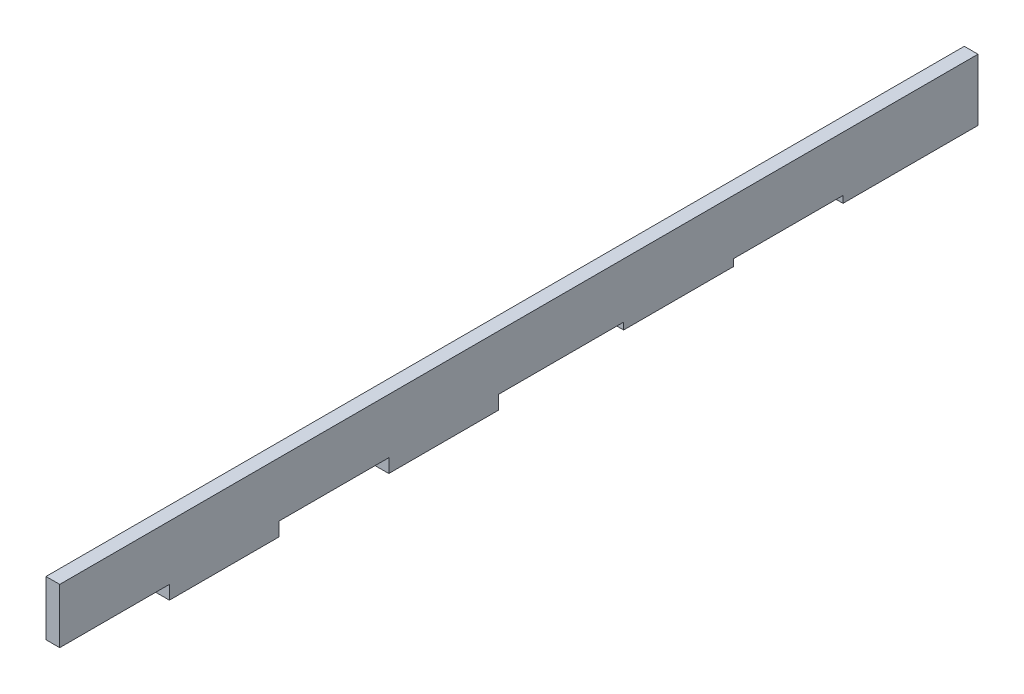
ISO-10303-21;
HEADER;
FILE_DESCRIPTION(('STEP AP214'),'2;1');
FILE_NAME('part.step','',(''),(''),'','','');
FILE_SCHEMA(('AUTOMOTIVE_DESIGN { 1 0 10303 214 1 1 1 1 }'));
ENDSEC;
DATA;
#1=APPLICATION_CONTEXT('core data for automotive mechanical design processes');
#2=APPLICATION_PROTOCOL_DEFINITION('international standard','automotive_design',2000,#1);
#3=PRODUCT_CONTEXT('',#1,'mechanical');
#4=PRODUCT('Part','Part','',(#3));
#5=PRODUCT_RELATED_PRODUCT_CATEGORY('part','',(#4));
#6=PRODUCT_DEFINITION_FORMATION('','',#4);
#7=PRODUCT_DEFINITION_CONTEXT('part definition',#1,'design');
#8=PRODUCT_DEFINITION('design','',#6,#7);
#9=PRODUCT_DEFINITION_SHAPE('','',#8);
#10=(LENGTH_UNIT() NAMED_UNIT(*) SI_UNIT(.MILLI.,.METRE.));
#11=(NAMED_UNIT(*) PLANE_ANGLE_UNIT() SI_UNIT($,.RADIAN.));
#12=(NAMED_UNIT(*) SI_UNIT($,.STERADIAN.) SOLID_ANGLE_UNIT());
#13=UNCERTAINTY_MEASURE_WITH_UNIT(LENGTH_MEASURE(1.E-05),#10,'distance_accuracy_value','');
#14=(GEOMETRIC_REPRESENTATION_CONTEXT(3) GLOBAL_UNCERTAINTY_ASSIGNED_CONTEXT((#13)) GLOBAL_UNIT_ASSIGNED_CONTEXT((#10,
#11,#12)) REPRESENTATION_CONTEXT('',''));
#15=CARTESIAN_POINT('',(0.,0.,0.));
#16=DIRECTION('',(0.,0.,1.));
#17=DIRECTION('',(1.,0.,0.));
#18=AXIS2_PLACEMENT_3D('',#15,#16,#17);
#19=CARTESIAN_POINT('',(6.35,6.34999999999997,-309.479378365372));
#20=DIRECTION('',(0.,1.,0.));
#21=DIRECTION('',(0.,0.,1.));
#22=AXIS2_PLACEMENT_3D('',#19,#20,#21);
#23=PLANE('',#22);
#24=DIRECTION('',(0.,0.,-1.));
#25=VECTOR('',#24,1.);
#26=CARTESIAN_POINT('',(0.,6.34999999999997,-309.479378365372));
#27=LINE('',#26,#25);
#28=CARTESIAN_POINT('',(0.,6.34999999999997,-309.479378365372));
#29=VERTEX_POINT('',#28);
#30=CARTESIAN_POINT('',(0.,6.34999999999997,-360.279378365372));
#31=VERTEX_POINT('',#30);
#32=EDGE_CURVE('E191',#29,#31,#27,.T.);
#33=ORIENTED_EDGE('',*,*,#32,.T.);
#34=DIRECTION('',(-1.,0.,0.));
#35=VECTOR('',#34,1.);
#36=CARTESIAN_POINT('',(6.35,6.34999999999997,-360.279378365372));
#37=LINE('',#36,#35);
#38=CARTESIAN_POINT('',(6.35,6.34999999999997,-360.279378365372));
#39=VERTEX_POINT('',#38);
#40=EDGE_CURVE('E11',#39,#31,#37,.T.);
#41=ORIENTED_EDGE('',*,*,#40,.F.);
#42=DIRECTION('',(0.,0.,-1.));
#43=VECTOR('',#42,1.);
#44=CARTESIAN_POINT('',(6.35,6.34999999999997,-309.479378365372));
#45=LINE('',#44,#43);
#46=CARTESIAN_POINT('',(6.35,6.34999999999997,-309.479378365372));
#47=VERTEX_POINT('',#46);
#48=EDGE_CURVE('E226',#47,#39,#45,.T.);
#49=ORIENTED_EDGE('',*,*,#48,.F.);
#50=DIRECTION('',(-1.,0.,0.));
#51=VECTOR('',#50,1.);
#52=CARTESIAN_POINT('',(6.35,6.34999999999997,-309.479378365372));
#53=LINE('',#52,#51);
#54=EDGE_CURVE('E187',#47,#29,#53,.T.);
#55=ORIENTED_EDGE('',*,*,#54,.T.);
#56=EDGE_LOOP('',(#33,#41,#49,#55));
#57=FACE_BOUND('',#56,.T.);
#58=ADVANCED_FACE('F35',(#57),#23,.F.);
#59=CARTESIAN_POINT('',(6.35,6.34999999999997,-360.279378365372));
#60=DIRECTION('',(0.,0.,-1.));
#61=DIRECTION('',(-1.,0.,0.));
#62=AXIS2_PLACEMENT_3D('',#59,#60,#61);
#63=PLANE('',#62);
#64=DIRECTION('',(0.,-1.,0.));
#65=VECTOR('',#64,1.);
#66=CARTESIAN_POINT('',(0.,6.34999999999997,-360.279378365372));
#67=LINE('',#66,#65);
#68=CARTESIAN_POINT('',(0.,3.17499999999997,-360.279378365372));
#69=VERTEX_POINT('',#68);
#70=EDGE_CURVE('E194',#31,#69,#67,.T.);
#71=ORIENTED_EDGE('',*,*,#70,.T.);
#72=DIRECTION('',(-1.,0.,0.));
#73=VECTOR('',#72,1.);
#74=CARTESIAN_POINT('',(6.35,3.17499999999997,-360.279378365372));
#75=LINE('',#74,#73);
#76=CARTESIAN_POINT('',(6.35,3.17499999999997,-360.279378365372));
#77=VERTEX_POINT('',#76);
#78=EDGE_CURVE('E43',#77,#69,#75,.T.);
#79=ORIENTED_EDGE('',*,*,#78,.F.);
#80=DIRECTION('',(0.,-1.,0.));
#81=VECTOR('',#80,1.);
#82=CARTESIAN_POINT('',(6.35,6.34999999999997,-360.279378365372));
#83=LINE('',#82,#81);
#84=EDGE_CURVE('E124',#39,#77,#83,.T.);
#85=ORIENTED_EDGE('',*,*,#84,.F.);
#86=ORIENTED_EDGE('',*,*,#40,.T.);
#87=EDGE_LOOP('',(#71,#79,#85,#86));
#88=FACE_BOUND('',#87,.T.);
#89=ADVANCED_FACE('F333',(#88),#63,.F.);
#90=CARTESIAN_POINT('',(6.35,3.17499999999997,-360.279378365372));
#91=DIRECTION('',(0.,1.,0.));
#92=DIRECTION('',(0.,0.,1.));
#93=AXIS2_PLACEMENT_3D('',#90,#91,#92);
#94=PLANE('',#93);
#95=DIRECTION('',(0.,0.,-1.));
#96=VECTOR('',#95,1.);
#97=CARTESIAN_POINT('',(0.,3.17499999999997,-360.279378365372));
#98=LINE('',#97,#96);
#99=CARTESIAN_POINT('',(0.,3.17499999999997,-422.789544579189));
#100=VERTEX_POINT('',#99);
#101=EDGE_CURVE('E196',#69,#100,#98,.T.);
#102=ORIENTED_EDGE('',*,*,#101,.T.);
#103=DIRECTION('',(-1.,0.,0.));
#104=VECTOR('',#103,1.);
#105=CARTESIAN_POINT('',(6.35,3.17499999999997,-422.789544579189));
#106=LINE('',#105,#104);
#107=CARTESIAN_POINT('',(6.35,3.17499999999997,-422.789544579189));
#108=VERTEX_POINT('',#107);
#109=EDGE_CURVE('E263',#108,#100,#106,.T.);
#110=ORIENTED_EDGE('',*,*,#109,.F.);
#111=DIRECTION('',(0.,0.,-1.));
#112=VECTOR('',#111,1.);
#113=CARTESIAN_POINT('',(6.35,3.17499999999997,-360.279378365372));
#114=LINE('',#113,#112);
#115=EDGE_CURVE('E271',#77,#108,#114,.T.);
#116=ORIENTED_EDGE('',*,*,#115,.F.);
#117=ORIENTED_EDGE('',*,*,#78,.T.);
#118=EDGE_LOOP('',(#102,#110,#116,#117));
#119=FACE_BOUND('',#118,.T.);
#120=ADVANCED_FACE('F269',(#119),#94,.F.);
#121=CARTESIAN_POINT('',(6.35,3.17499999999997,-422.789544579189));
#122=DIRECTION('',(0.,0.,1.));
#123=DIRECTION('',(1.,0.,0.));
#124=AXIS2_PLACEMENT_3D('',#121,#122,#123);
#125=PLANE('',#124);
#126=DIRECTION('',(0.,1.,0.));
#127=VECTOR('',#126,1.);
#128=CARTESIAN_POINT('',(0.,3.17499999999997,-422.789544579189));
#129=LINE('',#128,#127);
#130=CARTESIAN_POINT('',(0.,31.7499999999996,-422.789544579189));
#131=VERTEX_POINT('',#130);
#132=EDGE_CURVE('E198',#100,#131,#129,.T.);
#133=ORIENTED_EDGE('',*,*,#132,.T.);
#134=DIRECTION('',(-1.,0.,0.));
#135=VECTOR('',#134,1.);
#136=CARTESIAN_POINT('',(6.35,31.7499999999996,-422.789544579189));
#137=LINE('',#136,#135);
#138=CARTESIAN_POINT('',(6.35,31.7499999999996,-422.789544579189));
#139=VERTEX_POINT('',#138);
#140=EDGE_CURVE('E260',#139,#131,#137,.T.);
#141=ORIENTED_EDGE('',*,*,#140,.F.);
#142=DIRECTION('',(0.,1.,0.));
#143=VECTOR('',#142,1.);
#144=CARTESIAN_POINT('',(6.35,3.17499999999997,-422.789544579189));
#145=LINE('',#144,#143);
#146=EDGE_CURVE('E289',#108,#139,#145,.T.);
#147=ORIENTED_EDGE('',*,*,#146,.F.);
#148=ORIENTED_EDGE('',*,*,#109,.T.);
#149=EDGE_LOOP('',(#133,#141,#147,#148));
#150=FACE_BOUND('',#149,.T.);
#151=ADVANCED_FACE('F280',(#150),#125,.F.);
#152=CARTESIAN_POINT('',(6.35,31.7499999999996,2.48059425587843));
#153=DIRECTION('',(0.,-1.,0.));
#154=DIRECTION('',(0.,0.,-1.));
#155=AXIS2_PLACEMENT_3D('',#152,#153,#154);
#156=PLANE('',#155);
#157=DIRECTION('',(0.,0.,1.));
#158=VECTOR('',#157,1.);
#159=CARTESIAN_POINT('',(0.,31.7499999999996,2.48059425587843));
#160=LINE('',#159,#158);
#161=CARTESIAN_POINT('',(0.,31.7499999999996,2.48059425587843));
#162=VERTEX_POINT('',#161);
#163=EDGE_CURVE('E200',#131,#162,#160,.T.);
#164=ORIENTED_EDGE('',*,*,#163,.T.);
#165=DIRECTION('',(-1.,0.,0.));
#166=VECTOR('',#165,1.);
#167=CARTESIAN_POINT('',(6.35,31.7499999999996,2.48059425587843));
#168=LINE('',#167,#166);
#169=CARTESIAN_POINT('',(6.35,31.7499999999996,2.48059425587843));
#170=VERTEX_POINT('',#169);
#171=EDGE_CURVE('E257',#170,#162,#168,.T.);
#172=ORIENTED_EDGE('',*,*,#171,.F.);
#173=DIRECTION('',(0.,0.,1.));
#174=VECTOR('',#173,1.);
#175=CARTESIAN_POINT('',(6.35,31.7499999999996,2.48059425587843));
#176=LINE('',#175,#174);
#177=EDGE_CURVE('E286',#139,#170,#176,.T.);
#178=ORIENTED_EDGE('',*,*,#177,.F.);
#179=ORIENTED_EDGE('',*,*,#140,.T.);
#180=EDGE_LOOP('',(#164,#172,#178,#179));
#181=FACE_BOUND('',#180,.T.);
#182=ADVANCED_FACE('F284',(#181),#156,.F.);
#183=CARTESIAN_POINT('',(6.35,6.34999999999997,2.48059425587843));
#184=DIRECTION('',(0.,0.,-1.));
#185=DIRECTION('',(-1.,0.,0.));
#186=AXIS2_PLACEMENT_3D('',#183,#184,#185);
#187=PLANE('',#186);
#188=DIRECTION('',(0.,-1.,0.));
#189=VECTOR('',#188,1.);
#190=CARTESIAN_POINT('',(0.,6.34999999999997,2.48059425587843));
#191=LINE('',#190,#189);
#192=CARTESIAN_POINT('',(0.,6.34999999999997,2.48059425587843));
#193=VERTEX_POINT('',#192);
#194=EDGE_CURVE('E202',#162,#193,#191,.T.);
#195=ORIENTED_EDGE('',*,*,#194,.T.);
#196=DIRECTION('',(-1.,0.,0.));
#197=VECTOR('',#196,1.);
#198=CARTESIAN_POINT('',(6.35,6.34999999999997,2.48059425587843));
#199=LINE('',#198,#197);
#200=CARTESIAN_POINT('',(6.35,6.34999999999997,2.48059425587843));
#201=VERTEX_POINT('',#200);
#202=EDGE_CURVE('E254',#201,#193,#199,.T.);
#203=ORIENTED_EDGE('',*,*,#202,.F.);
#204=DIRECTION('',(0.,-1.,0.));
#205=VECTOR('',#204,1.);
#206=CARTESIAN_POINT('',(6.35,6.34999999999997,2.48059425587843));
#207=LINE('',#206,#205);
#208=EDGE_CURVE('E288',#170,#201,#207,.T.);
#209=ORIENTED_EDGE('',*,*,#208,.F.);
#210=ORIENTED_EDGE('',*,*,#171,.T.);
#211=EDGE_LOOP('',(#195,#203,#209,#210));
#212=FACE_BOUND('',#211,.T.);
#213=ADVANCED_FACE('F346',(#212),#187,.F.);
#214=CARTESIAN_POINT('',(6.35,6.34999999999997,2.48059425587843));
#215=DIRECTION('',(0.,1.,0.));
#216=DIRECTION('',(0.,0.,1.));
#217=AXIS2_PLACEMENT_3D('',#214,#215,#216);
#218=PLANE('',#217);
#219=DIRECTION('',(0.,0.,-1.));
#220=VECTOR('',#219,1.);
#221=CARTESIAN_POINT('',(0.,6.34999999999997,2.48059425587843));
#222=LINE('',#221,#220);
#223=CARTESIAN_POINT('',(0.,6.34999999999999,-48.3194057441216));
#224=VERTEX_POINT('',#223);
#225=EDGE_CURVE('E204',#193,#224,#222,.T.);
#226=ORIENTED_EDGE('',*,*,#225,.T.);
#227=DIRECTION('',(-1.,0.,0.));
#228=VECTOR('',#227,1.);
#229=CARTESIAN_POINT('',(6.35,6.34999999999999,-48.3194057441216));
#230=LINE('',#229,#228);
#231=CARTESIAN_POINT('',(6.35,6.34999999999999,-48.3194057441216));
#232=VERTEX_POINT('',#231);
#233=EDGE_CURVE('E251',#232,#224,#230,.T.);
#234=ORIENTED_EDGE('',*,*,#233,.F.);
#235=DIRECTION('',(0.,0.,-1.));
#236=VECTOR('',#235,1.);
#237=CARTESIAN_POINT('',(6.35,6.34999999999997,2.48059425587843));
#238=LINE('',#237,#236);
#239=EDGE_CURVE('E291',#201,#232,#238,.T.);
#240=ORIENTED_EDGE('',*,*,#239,.F.);
#241=ORIENTED_EDGE('',*,*,#202,.T.);
#242=EDGE_LOOP('',(#226,#234,#240,#241));
#243=FACE_BOUND('',#242,.T.);
#244=ADVANCED_FACE('F349',(#243),#218,.F.);
#245=CARTESIAN_POINT('',(6.35,6.34999999999999,-48.3194057441216));
#246=DIRECTION('',(0.,0.,-1.));
#247=DIRECTION('',(-1.,0.,0.));
#248=AXIS2_PLACEMENT_3D('',#245,#246,#247);
#249=PLANE('',#248);
#250=DIRECTION('',(0.,-1.,0.));
#251=VECTOR('',#250,1.);
#252=CARTESIAN_POINT('',(0.,6.34999999999999,-48.3194057441216));
#253=LINE('',#252,#251);
#254=CARTESIAN_POINT('',(0.,0.,-48.3194057441216));
#255=VERTEX_POINT('',#254);
#256=EDGE_CURVE('E206',#224,#255,#253,.T.);
#257=ORIENTED_EDGE('',*,*,#256,.T.);
#258=DIRECTION('',(-1.,0.,0.));
#259=VECTOR('',#258,1.);
#260=CARTESIAN_POINT('',(6.35,0.,-48.3194057441216));
#261=LINE('',#260,#259);
#262=CARTESIAN_POINT('',(6.35,0.,-48.3194057441216));
#263=VERTEX_POINT('',#262);
#264=EDGE_CURVE('E248',#263,#255,#261,.T.);
#265=ORIENTED_EDGE('',*,*,#264,.F.);
#266=DIRECTION('',(0.,-1.,0.));
#267=VECTOR('',#266,1.);
#268=CARTESIAN_POINT('',(6.35,6.34999999999999,-48.3194057441216));
#269=LINE('',#268,#267);
#270=EDGE_CURVE('E297',#232,#263,#269,.T.);
#271=ORIENTED_EDGE('',*,*,#270,.F.);
#272=ORIENTED_EDGE('',*,*,#233,.T.);
#273=EDGE_LOOP('',(#257,#265,#271,#272));
#274=FACE_BOUND('',#273,.T.);
#275=ADVANCED_FACE('F353',(#274),#249,.F.);
#276=CARTESIAN_POINT('',(6.35,0.,-48.3194057441216));
#277=DIRECTION('',(0.,1.,0.));
#278=DIRECTION('',(0.,0.,1.));
#279=AXIS2_PLACEMENT_3D('',#276,#277,#278);
#280=PLANE('',#279);
#281=DIRECTION('',(0.,0.,-1.));
#282=VECTOR('',#281,1.);
#283=CARTESIAN_POINT('',(0.,0.,-48.3194057441216));
#284=LINE('',#283,#282);
#285=CARTESIAN_POINT('',(0.,0.,-99.1194057441216));
#286=VERTEX_POINT('',#285);
#287=EDGE_CURVE('E208',#255,#286,#284,.T.);
#288=ORIENTED_EDGE('',*,*,#287,.T.);
#289=DIRECTION('',(-1.,0.,0.));
#290=VECTOR('',#289,1.);
#291=CARTESIAN_POINT('',(6.35,0.,-99.1194057441216));
#292=LINE('',#291,#290);
#293=CARTESIAN_POINT('',(6.35,0.,-99.1194057441216));
#294=VERTEX_POINT('',#293);
#295=EDGE_CURVE('E245',#294,#286,#292,.T.);
#296=ORIENTED_EDGE('',*,*,#295,.F.);
#297=DIRECTION('',(0.,0.,-1.));
#298=VECTOR('',#297,1.);
#299=CARTESIAN_POINT('',(6.35,0.,-48.3194057441216));
#300=LINE('',#299,#298);
#301=EDGE_CURVE('E299',#263,#294,#300,.T.);
#302=ORIENTED_EDGE('',*,*,#301,.F.);
#303=ORIENTED_EDGE('',*,*,#264,.T.);
#304=EDGE_LOOP('',(#288,#296,#302,#303));
#305=FACE_BOUND('',#304,.T.);
#306=ADVANCED_FACE('F357',(#305),#280,.F.);
#307=CARTESIAN_POINT('',(6.35,6.34999999999997,-99.1194057441216));
#308=DIRECTION('',(0.,0.,1.));
#309=DIRECTION('',(1.,0.,0.));
#310=AXIS2_PLACEMENT_3D('',#307,#308,#309);
#311=PLANE('',#310);
#312=DIRECTION('',(0.,1.,0.));
#313=VECTOR('',#312,1.);
#314=CARTESIAN_POINT('',(0.,6.34999999999997,-99.1194057441216));
#315=LINE('',#314,#313);
#316=CARTESIAN_POINT('',(0.,6.34999999999997,-99.1194057441216));
#317=VERTEX_POINT('',#316);
#318=EDGE_CURVE('E210',#286,#317,#315,.T.);
#319=ORIENTED_EDGE('',*,*,#318,.T.);
#320=DIRECTION('',(-1.,0.,0.));
#321=VECTOR('',#320,1.);
#322=CARTESIAN_POINT('',(6.35,6.34999999999997,-99.1194057441216));
#323=LINE('',#322,#321);
#324=CARTESIAN_POINT('',(6.35,6.34999999999997,-99.1194057441216));
#325=VERTEX_POINT('',#324);
#326=EDGE_CURVE('E242',#325,#317,#323,.T.);
#327=ORIENTED_EDGE('',*,*,#326,.F.);
#328=DIRECTION('',(0.,1.,0.));
#329=VECTOR('',#328,1.);
#330=CARTESIAN_POINT('',(6.35,6.34999999999997,-99.1194057441216));
#331=LINE('',#330,#329);
#332=EDGE_CURVE('E301',#294,#325,#331,.T.);
#333=ORIENTED_EDGE('',*,*,#332,.F.);
#334=ORIENTED_EDGE('',*,*,#295,.T.);
#335=EDGE_LOOP('',(#319,#327,#333,#334));
#336=FACE_BOUND('',#335,.T.);
#337=ADVANCED_FACE('F361',(#336),#311,.F.);
#338=CARTESIAN_POINT('',(6.35,6.34999999999997,-99.1194057441216));
#339=DIRECTION('',(0.,1.,0.));
#340=DIRECTION('',(0.,0.,1.));
#341=AXIS2_PLACEMENT_3D('',#338,#339,#340);
#342=PLANE('',#341);
#343=DIRECTION('',(0.,0.,-1.));
#344=VECTOR('',#343,1.);
#345=CARTESIAN_POINT('',(0.,6.34999999999997,-99.1194057441216));
#346=LINE('',#345,#344);
#347=CARTESIAN_POINT('',(0.,6.34999999999997,-149.919405744122));
#348=VERTEX_POINT('',#347);
#349=EDGE_CURVE('E212',#317,#348,#346,.T.);
#350=ORIENTED_EDGE('',*,*,#349,.T.);
#351=DIRECTION('',(-1.,0.,0.));
#352=VECTOR('',#351,1.);
#353=CARTESIAN_POINT('',(6.35,6.34999999999997,-149.919405744122));
#354=LINE('',#353,#352);
#355=CARTESIAN_POINT('',(6.35,6.34999999999997,-149.919405744122));
#356=VERTEX_POINT('',#355);
#357=EDGE_CURVE('E239',#356,#348,#354,.T.);
#358=ORIENTED_EDGE('',*,*,#357,.F.);
#359=DIRECTION('',(0.,0.,-1.));
#360=VECTOR('',#359,1.);
#361=CARTESIAN_POINT('',(6.35,6.34999999999997,-99.1194057441216));
#362=LINE('',#361,#360);
#363=EDGE_CURVE('E303',#325,#356,#362,.T.);
#364=ORIENTED_EDGE('',*,*,#363,.F.);
#365=ORIENTED_EDGE('',*,*,#326,.T.);
#366=EDGE_LOOP('',(#350,#358,#364,#365));
#367=FACE_BOUND('',#366,.T.);
#368=ADVANCED_FACE('F365',(#367),#342,.F.);
#369=CARTESIAN_POINT('',(6.35,6.34999999999997,-149.919405744122));
#370=DIRECTION('',(0.,0.,-1.));
#371=DIRECTION('',(-1.,0.,0.));
#372=AXIS2_PLACEMENT_3D('',#369,#370,#371);
#373=PLANE('',#372);
#374=DIRECTION('',(0.,-1.,0.));
#375=VECTOR('',#374,1.);
#376=CARTESIAN_POINT('',(0.,6.34999999999997,-149.919405744122));
#377=LINE('',#376,#375);
#378=CARTESIAN_POINT('',(0.,0.,-149.919405744122));
#379=VERTEX_POINT('',#378);
#380=EDGE_CURVE('E214',#348,#379,#377,.T.);
#381=ORIENTED_EDGE('',*,*,#380,.T.);
#382=DIRECTION('',(-1.,0.,0.));
#383=VECTOR('',#382,1.);
#384=CARTESIAN_POINT('',(6.35,0.,-149.919405744122));
#385=LINE('',#384,#383);
#386=CARTESIAN_POINT('',(6.35,0.,-149.919405744122));
#387=VERTEX_POINT('',#386);
#388=EDGE_CURVE('E236',#387,#379,#385,.T.);
#389=ORIENTED_EDGE('',*,*,#388,.F.);
#390=DIRECTION('',(0.,-1.,0.));
#391=VECTOR('',#390,1.);
#392=CARTESIAN_POINT('',(6.35,6.34999999999997,-149.919405744122));
#393=LINE('',#392,#391);
#394=EDGE_CURVE('E305',#356,#387,#393,.T.);
#395=ORIENTED_EDGE('',*,*,#394,.F.);
#396=ORIENTED_EDGE('',*,*,#357,.T.);
#397=EDGE_LOOP('',(#381,#389,#395,#396));
#398=FACE_BOUND('',#397,.T.);
#399=ADVANCED_FACE('F369',(#398),#373,.F.);
#400=CARTESIAN_POINT('',(6.35,0.,-149.919405744122));
#401=DIRECTION('',(0.,1.,0.));
#402=DIRECTION('',(0.,0.,1.));
#403=AXIS2_PLACEMENT_3D('',#400,#401,#402);
#404=PLANE('',#403);
#405=DIRECTION('',(0.,0.,-1.));
#406=VECTOR('',#405,1.);
#407=CARTESIAN_POINT('',(0.,0.,-149.919405744122));
#408=LINE('',#407,#406);
#409=CARTESIAN_POINT('',(0.,0.,-200.719405744122));
#410=VERTEX_POINT('',#409);
#411=EDGE_CURVE('E216',#379,#410,#408,.T.);
#412=ORIENTED_EDGE('',*,*,#411,.T.);
#413=DIRECTION('',(-1.,0.,0.));
#414=VECTOR('',#413,1.);
#415=CARTESIAN_POINT('',(6.35,0.,-200.719405744122));
#416=LINE('',#415,#414);
#417=CARTESIAN_POINT('',(6.35,0.,-200.719405744122));
#418=VERTEX_POINT('',#417);
#419=EDGE_CURVE('E233',#418,#410,#416,.T.);
#420=ORIENTED_EDGE('',*,*,#419,.F.);
#421=DIRECTION('',(0.,0.,-1.));
#422=VECTOR('',#421,1.);
#423=CARTESIAN_POINT('',(6.35,0.,-149.919405744122));
#424=LINE('',#423,#422);
#425=EDGE_CURVE('E307',#387,#418,#424,.T.);
#426=ORIENTED_EDGE('',*,*,#425,.F.);
#427=ORIENTED_EDGE('',*,*,#388,.T.);
#428=EDGE_LOOP('',(#412,#420,#426,#427));
#429=FACE_BOUND('',#428,.T.);
#430=ADVANCED_FACE('F373',(#429),#404,.F.);
#431=CARTESIAN_POINT('',(6.35,6.34999999999997,-200.719405744122));
#432=DIRECTION('',(0.,0.,1.));
#433=DIRECTION('',(1.,0.,0.));
#434=AXIS2_PLACEMENT_3D('',#431,#432,#433);
#435=PLANE('',#434);
#436=DIRECTION('',(0.,1.,0.));
#437=VECTOR('',#436,1.);
#438=CARTESIAN_POINT('',(0.,6.34999999999997,-200.719405744122));
#439=LINE('',#438,#437);
#440=CARTESIAN_POINT('',(0.,6.34999999999997,-200.719405744122));
#441=VERTEX_POINT('',#440);
#442=EDGE_CURVE('E218',#410,#441,#439,.T.);
#443=ORIENTED_EDGE('',*,*,#442,.T.);
#444=DIRECTION('',(-1.,0.,0.));
#445=VECTOR('',#444,1.);
#446=CARTESIAN_POINT('',(6.35,6.34999999999997,-200.719405744122));
#447=LINE('',#446,#445);
#448=CARTESIAN_POINT('',(6.35,6.34999999999997,-200.719405744122));
#449=VERTEX_POINT('',#448);
#450=EDGE_CURVE('E230',#449,#441,#447,.T.);
#451=ORIENTED_EDGE('',*,*,#450,.F.);
#452=DIRECTION('',(0.,1.,0.));
#453=VECTOR('',#452,1.);
#454=CARTESIAN_POINT('',(6.35,6.34999999999997,-200.719405744122));
#455=LINE('',#454,#453);
#456=EDGE_CURVE('E309',#418,#449,#455,.T.);
#457=ORIENTED_EDGE('',*,*,#456,.F.);
#458=ORIENTED_EDGE('',*,*,#419,.T.);
#459=EDGE_LOOP('',(#443,#451,#457,#458));
#460=FACE_BOUND('',#459,.T.);
#461=ADVANCED_FACE('F315',(#460),#435,.F.);
#462=CARTESIAN_POINT('',(6.35,6.34999999999997,-227.519405744122));
#463=DIRECTION('',(0.,1.,0.));
#464=DIRECTION('',(0.,0.,1.));
#465=AXIS2_PLACEMENT_3D('',#462,#463,#464);
#466=PLANE('',#465);
#467=DIRECTION('',(0.,0.,-1.));
#468=VECTOR('',#467,1.);
#469=CARTESIAN_POINT('',(0.,6.34999999999997,-227.519405744122));
#470=LINE('',#469,#468);
#471=CARTESIAN_POINT('',(0.,6.34999999999997,-258.679378365372));
#472=VERTEX_POINT('',#471);
#473=EDGE_CURVE('E221',#441,#472,#470,.T.);
#474=ORIENTED_EDGE('',*,*,#473,.T.);
#475=DIRECTION('',(-1.,0.,0.));
#476=VECTOR('',#475,1.);
#477=CARTESIAN_POINT('',(6.35,6.34999999999997,-258.679378365372));
#478=LINE('',#477,#476);
#479=CARTESIAN_POINT('',(6.35,6.34999999999997,-258.679378365372));
#480=VERTEX_POINT('',#479);
#481=EDGE_CURVE('E182',#480,#472,#478,.T.);
#482=ORIENTED_EDGE('',*,*,#481,.F.);
#483=DIRECTION('',(0.,0.,-1.));
#484=VECTOR('',#483,1.);
#485=CARTESIAN_POINT('',(6.35,6.34999999999997,-200.719405744122));
#486=LINE('',#485,#484);
#487=EDGE_CURVE('E173',#449,#480,#486,.T.);
#488=ORIENTED_EDGE('',*,*,#487,.F.);
#489=ORIENTED_EDGE('',*,*,#450,.T.);
#490=EDGE_LOOP('',(#474,#482,#488,#489));
#491=FACE_BOUND('',#490,.T.);
#492=ADVANCED_FACE('F318',(#491),#466,.F.);
#493=CARTESIAN_POINT('',(6.35,6.34999999999997,-258.679378365372));
#494=DIRECTION('',(0.,0.,-1.));
#495=DIRECTION('',(-1.,0.,0.));
#496=AXIS2_PLACEMENT_3D('',#493,#494,#495);
#497=PLANE('',#496);
#498=DIRECTION('',(0.,-1.,0.));
#499=VECTOR('',#498,1.);
#500=CARTESIAN_POINT('',(0.,6.34999999999997,-258.679378365372));
#501=LINE('',#500,#499);
#502=CARTESIAN_POINT('',(0.,3.17499999999997,-258.679378365372));
#503=VERTEX_POINT('',#502);
#504=EDGE_CURVE('E181',#472,#503,#501,.T.);
#505=ORIENTED_EDGE('',*,*,#504,.T.);
#506=DIRECTION('',(-1.,0.,0.));
#507=VECTOR('',#506,1.);
#508=CARTESIAN_POINT('',(6.35,3.17499999999997,-258.679378365372));
#509=LINE('',#508,#507);
#510=CARTESIAN_POINT('',(6.35,3.17499999999997,-258.679378365372));
#511=VERTEX_POINT('',#510);
#512=EDGE_CURVE('E178',#511,#503,#509,.T.);
#513=ORIENTED_EDGE('',*,*,#512,.F.);
#514=DIRECTION('',(0.,-1.,0.));
#515=VECTOR('',#514,1.);
#516=CARTESIAN_POINT('',(6.35,6.34999999999997,-258.679378365372));
#517=LINE('',#516,#515);
#518=EDGE_CURVE('E167',#480,#511,#517,.T.);
#519=ORIENTED_EDGE('',*,*,#518,.F.);
#520=ORIENTED_EDGE('',*,*,#481,.T.);
#521=EDGE_LOOP('',(#505,#513,#519,#520));
#522=FACE_BOUND('',#521,.T.);
#523=ADVANCED_FACE('F179',(#522),#497,.F.);
#524=CARTESIAN_POINT('',(6.35,3.17499999999997,-258.679378365372));
#525=DIRECTION('',(0.,1.,0.));
#526=DIRECTION('',(0.,0.,1.));
#527=AXIS2_PLACEMENT_3D('',#524,#525,#526);
#528=PLANE('',#527);
#529=DIRECTION('',(0.,0.,-1.));
#530=VECTOR('',#529,1.);
#531=CARTESIAN_POINT('',(0.,3.17499999999997,-258.679378365372));
#532=LINE('',#531,#530);
#533=CARTESIAN_POINT('',(0.,3.17499999999997,-309.479378365372));
#534=VERTEX_POINT('',#533);
#535=EDGE_CURVE('E110',#503,#534,#532,.T.);
#536=ORIENTED_EDGE('',*,*,#535,.T.);
#537=DIRECTION('',(-1.,0.,0.));
#538=VECTOR('',#537,1.);
#539=CARTESIAN_POINT('',(6.35,3.17499999999997,-309.479378365372));
#540=LINE('',#539,#538);
#541=CARTESIAN_POINT('',(6.35,3.17499999999997,-309.479378365372));
#542=VERTEX_POINT('',#541);
#543=EDGE_CURVE('E183',#542,#534,#540,.T.);
#544=ORIENTED_EDGE('',*,*,#543,.F.);
#545=DIRECTION('',(0.,0.,-1.));
#546=VECTOR('',#545,1.);
#547=CARTESIAN_POINT('',(6.35,3.17499999999997,-258.679378365372));
#548=LINE('',#547,#546);
#549=EDGE_CURVE('E171',#511,#542,#548,.T.);
#550=ORIENTED_EDGE('',*,*,#549,.F.);
#551=ORIENTED_EDGE('',*,*,#512,.T.);
#552=EDGE_LOOP('',(#536,#544,#550,#551));
#553=FACE_BOUND('',#552,.T.);
#554=ADVANCED_FACE('F185',(#553),#528,.F.);
#555=CARTESIAN_POINT('',(6.35,3.17499999999997,-309.479378365372));
#556=DIRECTION('',(0.,0.,1.));
#557=DIRECTION('',(1.,0.,0.));
#558=AXIS2_PLACEMENT_3D('',#555,#556,#557);
#559=PLANE('',#558);
#560=DIRECTION('',(0.,1.,0.));
#561=VECTOR('',#560,1.);
#562=CARTESIAN_POINT('',(0.,3.17499999999997,-309.479378365372));
#563=LINE('',#562,#561);
#564=EDGE_CURVE('E116',#534,#29,#563,.T.);
#565=ORIENTED_EDGE('',*,*,#564,.T.);
#566=ORIENTED_EDGE('',*,*,#54,.F.);
#567=DIRECTION('',(0.,1.,0.));
#568=VECTOR('',#567,1.);
#569=CARTESIAN_POINT('',(6.35,3.17499999999997,-309.479378365372));
#570=LINE('',#569,#568);
#571=EDGE_CURVE('E51',#542,#47,#570,.T.);
#572=ORIENTED_EDGE('',*,*,#571,.F.);
#573=ORIENTED_EDGE('',*,*,#543,.T.);
#574=EDGE_LOOP('',(#565,#566,#572,#573));
#575=FACE_BOUND('',#574,.T.);
#576=ADVANCED_FACE('F322',(#575),#559,.F.);
#577=CARTESIAN_POINT('',(6.35,0.,0.));
#578=DIRECTION('',(-1.,0.,0.));
#579=DIRECTION('',(0.,0.,1.));
#580=AXIS2_PLACEMENT_3D('',#577,#578,#579);
#581=PLANE('',#580);
#582=ORIENTED_EDGE('',*,*,#48,.T.);
#583=ORIENTED_EDGE('',*,*,#84,.T.);
#584=ORIENTED_EDGE('',*,*,#115,.T.);
#585=ORIENTED_EDGE('',*,*,#146,.T.);
#586=ORIENTED_EDGE('',*,*,#177,.T.);
#587=ORIENTED_EDGE('',*,*,#208,.T.);
#588=ORIENTED_EDGE('',*,*,#239,.T.);
#589=ORIENTED_EDGE('',*,*,#270,.T.);
#590=ORIENTED_EDGE('',*,*,#301,.T.);
#591=ORIENTED_EDGE('',*,*,#332,.T.);
#592=ORIENTED_EDGE('',*,*,#363,.T.);
#593=ORIENTED_EDGE('',*,*,#394,.T.);
#594=ORIENTED_EDGE('',*,*,#425,.T.);
#595=ORIENTED_EDGE('',*,*,#456,.T.);
#596=ORIENTED_EDGE('',*,*,#487,.T.);
#597=ORIENTED_EDGE('',*,*,#518,.T.);
#598=ORIENTED_EDGE('',*,*,#549,.T.);
#599=ORIENTED_EDGE('',*,*,#571,.T.);
#600=EDGE_LOOP('',(#582,#583,#584,#585,#586,#587,#588,#589,#590,#591,#592,#593,#594,#595,#596,
#597,#598,#599));
#601=FACE_BOUND('',#600,.T.);
#602=ADVANCED_FACE('F169',(#601),#581,.F.);
#603=CARTESIAN_POINT('',(0.,0.,0.));
#604=DIRECTION('',(-1.,0.,0.));
#605=DIRECTION('',(0.,0.,1.));
#606=AXIS2_PLACEMENT_3D('',#603,#604,#605);
#607=PLANE('',#606);
#608=ORIENTED_EDGE('',*,*,#32,.F.);
#609=ORIENTED_EDGE('',*,*,#564,.F.);
#610=ORIENTED_EDGE('',*,*,#535,.F.);
#611=ORIENTED_EDGE('',*,*,#504,.F.);
#612=ORIENTED_EDGE('',*,*,#473,.F.);
#613=ORIENTED_EDGE('',*,*,#442,.F.);
#614=ORIENTED_EDGE('',*,*,#411,.F.);
#615=ORIENTED_EDGE('',*,*,#380,.F.);
#616=ORIENTED_EDGE('',*,*,#349,.F.);
#617=ORIENTED_EDGE('',*,*,#318,.F.);
#618=ORIENTED_EDGE('',*,*,#287,.F.);
#619=ORIENTED_EDGE('',*,*,#256,.F.);
#620=ORIENTED_EDGE('',*,*,#225,.F.);
#621=ORIENTED_EDGE('',*,*,#194,.F.);
#622=ORIENTED_EDGE('',*,*,#163,.F.);
#623=ORIENTED_EDGE('',*,*,#132,.F.);
#624=ORIENTED_EDGE('',*,*,#101,.F.);
#625=ORIENTED_EDGE('',*,*,#70,.F.);
#626=EDGE_LOOP('',(#608,#609,#610,#611,#612,#613,#614,#615,#616,#617,#618,#619,#620,#621,#622,
#623,#624,#625));
#627=FACE_BOUND('',#626,.T.);
#628=ADVANCED_FACE('F275',(#627),#607,.T.);
#629=CLOSED_SHELL('',(#58,#89,#120,#151,#182,#213,#244,#275,#306,#337,#368,#399,#430,#461,#492,
#523,#554,#576,#602,#628));
#630=MANIFOLD_SOLID_BREP('B2',#629);
#631=ADVANCED_BREP_SHAPE_REPRESENTATION('',(#18,#630),#14);
#632=SHAPE_DEFINITION_REPRESENTATION(#9,#631);
ENDSEC;
END-ISO-10303-21;
